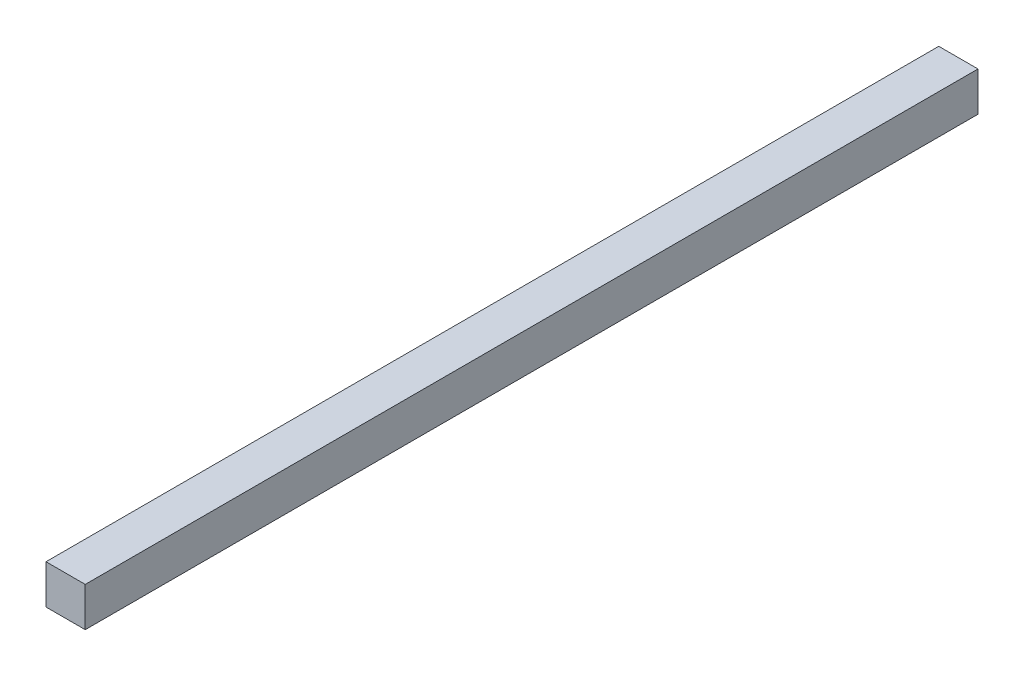
ISO-10303-21;
HEADER;
FILE_DESCRIPTION(('STEP AP214'),'2;1');
FILE_NAME('part.step','',(''),(''),'','','');
FILE_SCHEMA(('AUTOMOTIVE_DESIGN { 1 0 10303 214 1 1 1 1 }'));
ENDSEC;
DATA;
#1=APPLICATION_CONTEXT('core data for automotive mechanical design processes');
#2=APPLICATION_PROTOCOL_DEFINITION('international standard','automotive_design',2000,#1);
#3=PRODUCT_CONTEXT('',#1,'mechanical');
#4=PRODUCT('Part','Part','',(#3));
#5=PRODUCT_RELATED_PRODUCT_CATEGORY('part','',(#4));
#6=PRODUCT_DEFINITION_FORMATION('','',#4);
#7=PRODUCT_DEFINITION_CONTEXT('part definition',#1,'design');
#8=PRODUCT_DEFINITION('design','',#6,#7);
#9=PRODUCT_DEFINITION_SHAPE('','',#8);
#10=(LENGTH_UNIT() NAMED_UNIT(*) SI_UNIT(.MILLI.,.METRE.));
#11=(NAMED_UNIT(*) PLANE_ANGLE_UNIT() SI_UNIT($,.RADIAN.));
#12=(NAMED_UNIT(*) SI_UNIT($,.STERADIAN.) SOLID_ANGLE_UNIT());
#13=UNCERTAINTY_MEASURE_WITH_UNIT(LENGTH_MEASURE(1.E-05),#10,'distance_accuracy_value','');
#14=(GEOMETRIC_REPRESENTATION_CONTEXT(3) GLOBAL_UNCERTAINTY_ASSIGNED_CONTEXT((#13)) GLOBAL_UNIT_ASSIGNED_CONTEXT((#10,
#11,#12)) REPRESENTATION_CONTEXT('',''));
#15=CARTESIAN_POINT('',(0.,0.,0.));
#16=DIRECTION('',(0.,0.,1.));
#17=DIRECTION('',(1.,0.,0.));
#18=AXIS2_PLACEMENT_3D('',#15,#16,#17);
#19=CARTESIAN_POINT('',(-20.,20.,910.));
#20=DIRECTION('',(1.,0.,0.));
#21=DIRECTION('',(0.,1.,0.));
#22=AXIS2_PLACEMENT_3D('',#19,#20,#21);
#23=PLANE('',#22);
#24=DIRECTION('',(0.,-1.,0.));
#25=VECTOR('',#24,1.);
#26=CARTESIAN_POINT('',(-20.,20.,0.));
#27=LINE('',#26,#25);
#28=CARTESIAN_POINT('',(-20.,20.,0.));
#29=VERTEX_POINT('',#28);
#30=CARTESIAN_POINT('',(-20.,-20.,0.));
#31=VERTEX_POINT('',#30);
#32=EDGE_CURVE('E107',#29,#31,#27,.T.);
#33=ORIENTED_EDGE('',*,*,#32,.T.);
#34=DIRECTION('',(0.,0.,-1.));
#35=VECTOR('',#34,1.);
#36=CARTESIAN_POINT('',(-20.,-20.,910.));
#37=LINE('',#36,#35);
#38=CARTESIAN_POINT('',(-20.,-20.,910.));
#39=VERTEX_POINT('',#38);
#40=EDGE_CURVE('E11',#39,#31,#37,.T.);
#41=ORIENTED_EDGE('',*,*,#40,.F.);
#42=DIRECTION('',(0.,-1.,0.));
#43=VECTOR('',#42,1.);
#44=CARTESIAN_POINT('',(-20.,20.,910.));
#45=LINE('',#44,#43);
#46=CARTESIAN_POINT('',(-20.,20.,910.));
#47=VERTEX_POINT('',#46);
#48=EDGE_CURVE('E91',#47,#39,#45,.T.);
#49=ORIENTED_EDGE('',*,*,#48,.F.);
#50=DIRECTION('',(0.,0.,-1.));
#51=VECTOR('',#50,1.);
#52=CARTESIAN_POINT('',(-20.,20.,910.));
#53=LINE('',#52,#51);
#54=EDGE_CURVE('E103',#47,#29,#53,.T.);
#55=ORIENTED_EDGE('',*,*,#54,.T.);
#56=EDGE_LOOP('',(#33,#41,#49,#55));
#57=FACE_BOUND('',#56,.T.);
#58=ADVANCED_FACE('F39',(#57),#23,.F.);
#59=CARTESIAN_POINT('',(-20.,-20.,910.));
#60=DIRECTION('',(0.,1.,0.));
#61=DIRECTION('',(0.,0.,1.));
#62=AXIS2_PLACEMENT_3D('',#59,#60,#61);
#63=PLANE('',#62);
#64=DIRECTION('',(1.,0.,0.));
#65=VECTOR('',#64,1.);
#66=CARTESIAN_POINT('',(-20.,-20.,0.));
#67=LINE('',#66,#65);
#68=CARTESIAN_POINT('',(20.,-20.,0.));
#69=VERTEX_POINT('',#68);
#70=EDGE_CURVE('E96',#31,#69,#67,.T.);
#71=ORIENTED_EDGE('',*,*,#70,.T.);
#72=DIRECTION('',(0.,0.,-1.));
#73=VECTOR('',#72,1.);
#74=CARTESIAN_POINT('',(20.,-20.,910.));
#75=LINE('',#74,#73);
#76=CARTESIAN_POINT('',(20.,-20.,910.));
#77=VERTEX_POINT('',#76);
#78=EDGE_CURVE('E48',#77,#69,#75,.T.);
#79=ORIENTED_EDGE('',*,*,#78,.F.);
#80=DIRECTION('',(1.,0.,0.));
#81=VECTOR('',#80,1.);
#82=CARTESIAN_POINT('',(-20.,-20.,910.));
#83=LINE('',#82,#81);
#84=EDGE_CURVE('E86',#39,#77,#83,.T.);
#85=ORIENTED_EDGE('',*,*,#84,.F.);
#86=ORIENTED_EDGE('',*,*,#40,.T.);
#87=EDGE_LOOP('',(#71,#79,#85,#86));
#88=FACE_BOUND('',#87,.T.);
#89=ADVANCED_FACE('F95',(#88),#63,.F.);
#90=CARTESIAN_POINT('',(20.,20.,910.));
#91=DIRECTION('',(-1.,0.,0.));
#92=DIRECTION('',(0.,-1.,0.));
#93=AXIS2_PLACEMENT_3D('',#90,#91,#92);
#94=PLANE('',#93);
#95=DIRECTION('',(0.,1.,0.));
#96=VECTOR('',#95,1.);
#97=CARTESIAN_POINT('',(20.,20.,0.));
#98=LINE('',#97,#96);
#99=CARTESIAN_POINT('',(20.,20.,0.));
#100=VERTEX_POINT('',#99);
#101=EDGE_CURVE('E73',#69,#100,#98,.T.);
#102=ORIENTED_EDGE('',*,*,#101,.T.);
#103=DIRECTION('',(0.,0.,-1.));
#104=VECTOR('',#103,1.);
#105=CARTESIAN_POINT('',(20.,20.,910.));
#106=LINE('',#105,#104);
#107=CARTESIAN_POINT('',(20.,20.,910.));
#108=VERTEX_POINT('',#107);
#109=EDGE_CURVE('E98',#108,#100,#106,.T.);
#110=ORIENTED_EDGE('',*,*,#109,.F.);
#111=DIRECTION('',(0.,1.,0.));
#112=VECTOR('',#111,1.);
#113=CARTESIAN_POINT('',(20.,20.,910.));
#114=LINE('',#113,#112);
#115=EDGE_CURVE('E89',#77,#108,#114,.T.);
#116=ORIENTED_EDGE('',*,*,#115,.F.);
#117=ORIENTED_EDGE('',*,*,#78,.T.);
#118=EDGE_LOOP('',(#102,#110,#116,#117));
#119=FACE_BOUND('',#118,.T.);
#120=ADVANCED_FACE('F99',(#119),#94,.F.);
#121=CARTESIAN_POINT('',(-20.,20.,910.));
#122=DIRECTION('',(0.,-1.,0.));
#123=DIRECTION('',(0.,0.,-1.));
#124=AXIS2_PLACEMENT_3D('',#121,#122,#123);
#125=PLANE('',#124);
#126=DIRECTION('',(-1.,0.,0.));
#127=VECTOR('',#126,1.);
#128=CARTESIAN_POINT('',(-20.,20.,0.));
#129=LINE('',#128,#127);
#130=EDGE_CURVE('E79',#100,#29,#129,.T.);
#131=ORIENTED_EDGE('',*,*,#130,.T.);
#132=ORIENTED_EDGE('',*,*,#54,.F.);
#133=DIRECTION('',(-1.,0.,0.));
#134=VECTOR('',#133,1.);
#135=CARTESIAN_POINT('',(-20.,20.,910.));
#136=LINE('',#135,#134);
#137=EDGE_CURVE('E56',#108,#47,#136,.T.);
#138=ORIENTED_EDGE('',*,*,#137,.F.);
#139=ORIENTED_EDGE('',*,*,#109,.T.);
#140=EDGE_LOOP('',(#131,#132,#138,#139));
#141=FACE_BOUND('',#140,.T.);
#142=ADVANCED_FACE('F120',(#141),#125,.F.);
#143=CARTESIAN_POINT('',(0.,0.,910.));
#144=DIRECTION('',(0.,0.,1.));
#145=DIRECTION('',(1.,0.,0.));
#146=AXIS2_PLACEMENT_3D('',#143,#144,#145);
#147=PLANE('',#146);
#148=ORIENTED_EDGE('',*,*,#48,.T.);
#149=ORIENTED_EDGE('',*,*,#84,.T.);
#150=ORIENTED_EDGE('',*,*,#115,.T.);
#151=ORIENTED_EDGE('',*,*,#137,.T.);
#152=EDGE_LOOP('',(#148,#149,#150,#151));
#153=FACE_BOUND('',#152,.T.);
#154=ADVANCED_FACE('F87',(#153),#147,.T.);
#155=CARTESIAN_POINT('',(0.,0.,0.));
#156=DIRECTION('',(0.,0.,1.));
#157=DIRECTION('',(1.,0.,0.));
#158=AXIS2_PLACEMENT_3D('',#155,#156,#157);
#159=PLANE('',#158);
#160=ORIENTED_EDGE('',*,*,#32,.F.);
#161=ORIENTED_EDGE('',*,*,#130,.F.);
#162=ORIENTED_EDGE('',*,*,#101,.F.);
#163=ORIENTED_EDGE('',*,*,#70,.F.);
#164=EDGE_LOOP('',(#160,#161,#162,#163));
#165=FACE_BOUND('',#164,.T.);
#166=ADVANCED_FACE('F123',(#165),#159,.F.);
#167=CLOSED_SHELL('',(#58,#89,#120,#142,#154,#166));
#168=MANIFOLD_SOLID_BREP('B2',#167);
#169=ADVANCED_BREP_SHAPE_REPRESENTATION('',(#18,#168),#14);
#170=SHAPE_DEFINITION_REPRESENTATION(#9,#169);
ENDSEC;
END-ISO-10303-21;
